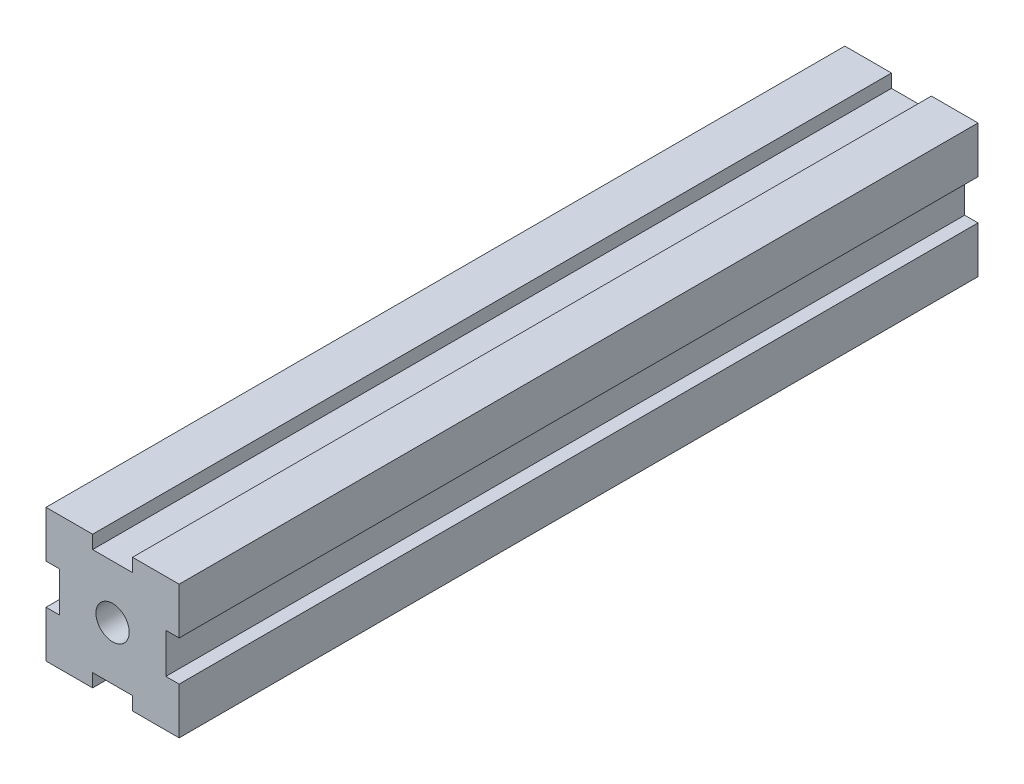
ISO-10303-21;
HEADER;
FILE_DESCRIPTION(('STEP AP214'),'2;1');
FILE_NAME('part.step','',(''),(''),'','','');
FILE_SCHEMA(('AUTOMOTIVE_DESIGN { 1 0 10303 214 1 1 1 1 }'));
ENDSEC;
DATA;
#1=APPLICATION_CONTEXT('core data for automotive mechanical design processes');
#2=APPLICATION_PROTOCOL_DEFINITION('international standard','automotive_design',2000,#1);
#3=PRODUCT_CONTEXT('',#1,'mechanical');
#4=PRODUCT('Part','Part','',(#3));
#5=PRODUCT_RELATED_PRODUCT_CATEGORY('part','',(#4));
#6=PRODUCT_DEFINITION_FORMATION('','',#4);
#7=PRODUCT_DEFINITION_CONTEXT('part definition',#1,'design');
#8=PRODUCT_DEFINITION('design','',#6,#7);
#9=PRODUCT_DEFINITION_SHAPE('','',#8);
#10=(LENGTH_UNIT() NAMED_UNIT(*) SI_UNIT(.MILLI.,.METRE.));
#11=(NAMED_UNIT(*) PLANE_ANGLE_UNIT() SI_UNIT($,.RADIAN.));
#12=(NAMED_UNIT(*) SI_UNIT($,.STERADIAN.) SOLID_ANGLE_UNIT());
#13=UNCERTAINTY_MEASURE_WITH_UNIT(LENGTH_MEASURE(1.E-05),#10,'distance_accuracy_value','');
#14=(GEOMETRIC_REPRESENTATION_CONTEXT(3) GLOBAL_UNCERTAINTY_ASSIGNED_CONTEXT((#13)) GLOBAL_UNIT_ASSIGNED_CONTEXT((#10,
#11,#12)) REPRESENTATION_CONTEXT('',''));
#15=CARTESIAN_POINT('',(0.,0.,0.));
#16=DIRECTION('',(0.,0.,1.));
#17=DIRECTION('',(1.,0.,0.));
#18=AXIS2_PLACEMENT_3D('',#15,#16,#17);
#19=CARTESIAN_POINT('',(0.,0.,120.));
#20=DIRECTION('',(0.,0.,1.));
#21=DIRECTION('',(1.,0.,0.));
#22=AXIS2_PLACEMENT_3D('',#19,#20,#21);
#23=PLANE('',#22);
#24=DIRECTION('',(0.,-1.,0.));
#25=VECTOR('',#24,1.);
#26=CARTESIAN_POINT('',(0.,0.,120.));
#27=LINE('',#26,#25);
#28=CARTESIAN_POINT('',(0.,0.,120.));
#29=VERTEX_POINT('',#28);
#30=CARTESIAN_POINT('',(0.,-7.,120.));
#31=VERTEX_POINT('',#30);
#32=EDGE_CURVE('E242',#29,#31,#27,.T.);
#33=ORIENTED_EDGE('',*,*,#32,.T.);
#34=DIRECTION('',(1.,0.,0.));
#35=VECTOR('',#34,1.);
#36=CARTESIAN_POINT('',(0.,-7.,120.));
#37=LINE('',#36,#35);
#38=CARTESIAN_POINT('',(2.,-7.,120.));
#39=VERTEX_POINT('',#38);
#40=EDGE_CURVE('E130',#31,#39,#37,.T.);
#41=ORIENTED_EDGE('',*,*,#40,.T.);
#42=DIRECTION('',(0.,-1.,0.));
#43=VECTOR('',#42,1.);
#44=CARTESIAN_POINT('',(2.,-7.,120.));
#45=LINE('',#44,#43);
#46=CARTESIAN_POINT('',(2.,-13.,120.));
#47=VERTEX_POINT('',#46);
#48=EDGE_CURVE('E293',#39,#47,#45,.T.);
#49=ORIENTED_EDGE('',*,*,#48,.T.);
#50=DIRECTION('',(-1.,0.,0.));
#51=VECTOR('',#50,1.);
#52=CARTESIAN_POINT('',(0.,-13.,120.));
#53=LINE('',#52,#51);
#54=CARTESIAN_POINT('',(0.,-13.,120.));
#55=VERTEX_POINT('',#54);
#56=EDGE_CURVE('E312',#47,#55,#53,.T.);
#57=ORIENTED_EDGE('',*,*,#56,.T.);
#58=DIRECTION('',(0.,-1.,0.));
#59=VECTOR('',#58,1.);
#60=CARTESIAN_POINT('',(0.,-13.,120.));
#61=LINE('',#60,#59);
#62=CARTESIAN_POINT('',(0.,-20.,120.));
#63=VERTEX_POINT('',#62);
#64=EDGE_CURVE('E309',#55,#63,#61,.T.);
#65=ORIENTED_EDGE('',*,*,#64,.T.);
#66=DIRECTION('',(1.,0.,0.));
#67=VECTOR('',#66,1.);
#68=CARTESIAN_POINT('',(0.,-20.,120.));
#69=LINE('',#68,#67);
#70=CARTESIAN_POINT('',(7.,-20.,120.));
#71=VERTEX_POINT('',#70);
#72=EDGE_CURVE('E311',#63,#71,#69,.T.);
#73=ORIENTED_EDGE('',*,*,#72,.T.);
#74=DIRECTION('',(0.,1.,0.));
#75=VECTOR('',#74,1.);
#76=CARTESIAN_POINT('',(7.,-20.,120.));
#77=LINE('',#76,#75);
#78=CARTESIAN_POINT('',(7.,-18.,120.));
#79=VERTEX_POINT('',#78);
#80=EDGE_CURVE('E314',#71,#79,#77,.T.);
#81=ORIENTED_EDGE('',*,*,#80,.T.);
#82=DIRECTION('',(1.,0.,0.));
#83=VECTOR('',#82,1.);
#84=CARTESIAN_POINT('',(7.,-18.,120.));
#85=LINE('',#84,#83);
#86=CARTESIAN_POINT('',(13.,-18.,120.));
#87=VERTEX_POINT('',#86);
#88=EDGE_CURVE('E320',#79,#87,#85,.T.);
#89=ORIENTED_EDGE('',*,*,#88,.T.);
#90=DIRECTION('',(0.,-1.,0.));
#91=VECTOR('',#90,1.);
#92=CARTESIAN_POINT('',(13.,-20.,120.));
#93=LINE('',#92,#91);
#94=CARTESIAN_POINT('',(13.,-20.,120.));
#95=VERTEX_POINT('',#94);
#96=EDGE_CURVE('E322',#87,#95,#93,.T.);
#97=ORIENTED_EDGE('',*,*,#96,.T.);
#98=DIRECTION('',(1.,0.,0.));
#99=VECTOR('',#98,1.);
#100=CARTESIAN_POINT('',(13.,-20.,120.));
#101=LINE('',#100,#99);
#102=CARTESIAN_POINT('',(20.,-20.,120.));
#103=VERTEX_POINT('',#102);
#104=EDGE_CURVE('E324',#95,#103,#101,.T.);
#105=ORIENTED_EDGE('',*,*,#104,.T.);
#106=DIRECTION('',(0.,1.,0.));
#107=VECTOR('',#106,1.);
#108=CARTESIAN_POINT('',(20.,-13.,120.));
#109=LINE('',#108,#107);
#110=CARTESIAN_POINT('',(20.,-13.,120.));
#111=VERTEX_POINT('',#110);
#112=EDGE_CURVE('E326',#103,#111,#109,.T.);
#113=ORIENTED_EDGE('',*,*,#112,.T.);
#114=DIRECTION('',(-1.,0.,0.));
#115=VECTOR('',#114,1.);
#116=CARTESIAN_POINT('',(20.,-13.,120.));
#117=LINE('',#116,#115);
#118=CARTESIAN_POINT('',(18.,-13.,120.));
#119=VERTEX_POINT('',#118);
#120=EDGE_CURVE('E328',#111,#119,#117,.T.);
#121=ORIENTED_EDGE('',*,*,#120,.T.);
#122=DIRECTION('',(0.,1.,0.));
#123=VECTOR('',#122,1.);
#124=CARTESIAN_POINT('',(18.,-7.,120.));
#125=LINE('',#124,#123);
#126=CARTESIAN_POINT('',(18.,-7.,120.));
#127=VERTEX_POINT('',#126);
#128=EDGE_CURVE('E330',#119,#127,#125,.T.);
#129=ORIENTED_EDGE('',*,*,#128,.T.);
#130=DIRECTION('',(1.,0.,0.));
#131=VECTOR('',#130,1.);
#132=CARTESIAN_POINT('',(20.,-7.,120.));
#133=LINE('',#132,#131);
#134=CARTESIAN_POINT('',(20.,-7.,120.));
#135=VERTEX_POINT('',#134);
#136=EDGE_CURVE('E332',#127,#135,#133,.T.);
#137=ORIENTED_EDGE('',*,*,#136,.T.);
#138=DIRECTION('',(0.,1.,0.));
#139=VECTOR('',#138,1.);
#140=CARTESIAN_POINT('',(20.,0.,120.));
#141=LINE('',#140,#139);
#142=CARTESIAN_POINT('',(20.,0.,120.));
#143=VERTEX_POINT('',#142);
#144=EDGE_CURVE('E334',#135,#143,#141,.T.);
#145=ORIENTED_EDGE('',*,*,#144,.T.);
#146=DIRECTION('',(-1.,0.,0.));
#147=VECTOR('',#146,1.);
#148=CARTESIAN_POINT('',(13.,0.,120.));
#149=LINE('',#148,#147);
#150=CARTESIAN_POINT('',(13.,0.,120.));
#151=VERTEX_POINT('',#150);
#152=EDGE_CURVE('E336',#143,#151,#149,.T.);
#153=ORIENTED_EDGE('',*,*,#152,.T.);
#154=DIRECTION('',(0.,-1.,0.));
#155=VECTOR('',#154,1.);
#156=CARTESIAN_POINT('',(13.,0.,120.));
#157=LINE('',#156,#155);
#158=CARTESIAN_POINT('',(13.,-2.,120.));
#159=VERTEX_POINT('',#158);
#160=EDGE_CURVE('E185',#151,#159,#157,.T.);
#161=ORIENTED_EDGE('',*,*,#160,.T.);
#162=DIRECTION('',(-1.,0.,0.));
#163=VECTOR('',#162,1.);
#164=CARTESIAN_POINT('',(7.,-2.,120.));
#165=LINE('',#164,#163);
#166=CARTESIAN_POINT('',(7.,-2.,120.));
#167=VERTEX_POINT('',#166);
#168=EDGE_CURVE('E179',#159,#167,#165,.T.);
#169=ORIENTED_EDGE('',*,*,#168,.T.);
#170=DIRECTION('',(0.,1.,0.));
#171=VECTOR('',#170,1.);
#172=CARTESIAN_POINT('',(7.,0.,120.));
#173=LINE('',#172,#171);
#174=CARTESIAN_POINT('',(7.,0.,120.));
#175=VERTEX_POINT('',#174);
#176=EDGE_CURVE('E183',#167,#175,#173,.T.);
#177=ORIENTED_EDGE('',*,*,#176,.T.);
#178=DIRECTION('',(-1.,0.,0.));
#179=VECTOR('',#178,1.);
#180=CARTESIAN_POINT('',(0.,0.,120.));
#181=LINE('',#180,#179);
#182=EDGE_CURVE('E51',#175,#29,#181,.T.);
#183=ORIENTED_EDGE('',*,*,#182,.T.);
#184=EDGE_LOOP('',(#33,#41,#49,#57,#65,#73,#81,#89,#97,#105,#113,#121,#129,#137,#145,#153,#161,
#169,#177,#183));
#185=FACE_BOUND('',#184,.T.);
#186=CARTESIAN_POINT('',(10.,-10.,120.));
#187=DIRECTION('',(0.,0.,1.));
#188=DIRECTION('',(1.,0.,0.));
#189=AXIS2_PLACEMENT_3D('',#186,#187,#188);
#190=CIRCLE('',#189,2.5);
#191=CARTESIAN_POINT('',(12.5,-10.,120.));
#192=VERTEX_POINT('',#191);
#193=EDGE_CURVE('E207',#192,#192,#190,.T.);
#194=ORIENTED_EDGE('',*,*,#193,.F.);
#195=EDGE_LOOP('',(#194));
#196=FACE_BOUND('',#195,.T.);
#197=ADVANCED_FACE('F34',(#185,#196),#23,.T.);
#198=CARTESIAN_POINT('',(0.,0.,0.));
#199=DIRECTION('',(0.,0.,1.));
#200=DIRECTION('',(1.,0.,0.));
#201=AXIS2_PLACEMENT_3D('',#198,#199,#200);
#202=PLANE('',#201);
#203=DIRECTION('',(0.,-1.,0.));
#204=VECTOR('',#203,1.);
#205=CARTESIAN_POINT('',(0.,0.,0.));
#206=LINE('',#205,#204);
#207=CARTESIAN_POINT('',(0.,0.,0.));
#208=VERTEX_POINT('',#207);
#209=CARTESIAN_POINT('',(0.,-7.,0.));
#210=VERTEX_POINT('',#209);
#211=EDGE_CURVE('E203',#208,#210,#206,.T.);
#212=ORIENTED_EDGE('',*,*,#211,.F.);
#213=DIRECTION('',(-1.,0.,0.));
#214=VECTOR('',#213,1.);
#215=CARTESIAN_POINT('',(0.,0.,0.));
#216=LINE('',#215,#214);
#217=CARTESIAN_POINT('',(7.,0.,0.));
#218=VERTEX_POINT('',#217);
#219=EDGE_CURVE('E122',#218,#208,#216,.T.);
#220=ORIENTED_EDGE('',*,*,#219,.F.);
#221=DIRECTION('',(0.,1.,0.));
#222=VECTOR('',#221,1.);
#223=CARTESIAN_POINT('',(7.,0.,0.));
#224=LINE('',#223,#222);
#225=CARTESIAN_POINT('',(7.,-2.,0.));
#226=VERTEX_POINT('',#225);
#227=EDGE_CURVE('E116',#226,#218,#224,.T.);
#228=ORIENTED_EDGE('',*,*,#227,.F.);
#229=DIRECTION('',(-1.,0.,0.));
#230=VECTOR('',#229,1.);
#231=CARTESIAN_POINT('',(7.,-2.,0.));
#232=LINE('',#231,#230);
#233=CARTESIAN_POINT('',(13.,-2.,0.));
#234=VERTEX_POINT('',#233);
#235=EDGE_CURVE('E193',#234,#226,#232,.T.);
#236=ORIENTED_EDGE('',*,*,#235,.F.);
#237=DIRECTION('',(0.,-1.,0.));
#238=VECTOR('',#237,1.);
#239=CARTESIAN_POINT('',(13.,0.,0.));
#240=LINE('',#239,#238);
#241=CARTESIAN_POINT('',(13.,0.,0.));
#242=VERTEX_POINT('',#241);
#243=EDGE_CURVE('E237',#242,#234,#240,.T.);
#244=ORIENTED_EDGE('',*,*,#243,.F.);
#245=DIRECTION('',(-1.,0.,0.));
#246=VECTOR('',#245,1.);
#247=CARTESIAN_POINT('',(13.,0.,0.));
#248=LINE('',#247,#246);
#249=CARTESIAN_POINT('',(20.,0.,0.));
#250=VERTEX_POINT('',#249);
#251=EDGE_CURVE('E235',#250,#242,#248,.T.);
#252=ORIENTED_EDGE('',*,*,#251,.F.);
#253=DIRECTION('',(0.,1.,0.));
#254=VECTOR('',#253,1.);
#255=CARTESIAN_POINT('',(20.,0.,0.));
#256=LINE('',#255,#254);
#257=CARTESIAN_POINT('',(20.,-7.,0.));
#258=VERTEX_POINT('',#257);
#259=EDGE_CURVE('E233',#258,#250,#256,.T.);
#260=ORIENTED_EDGE('',*,*,#259,.F.);
#261=DIRECTION('',(1.,0.,0.));
#262=VECTOR('',#261,1.);
#263=CARTESIAN_POINT('',(20.,-7.,0.));
#264=LINE('',#263,#262);
#265=CARTESIAN_POINT('',(18.,-7.,0.));
#266=VERTEX_POINT('',#265);
#267=EDGE_CURVE('E231',#266,#258,#264,.T.);
#268=ORIENTED_EDGE('',*,*,#267,.F.);
#269=DIRECTION('',(0.,1.,0.));
#270=VECTOR('',#269,1.);
#271=CARTESIAN_POINT('',(18.,-7.,0.));
#272=LINE('',#271,#270);
#273=CARTESIAN_POINT('',(18.,-13.,0.));
#274=VERTEX_POINT('',#273);
#275=EDGE_CURVE('E229',#274,#266,#272,.T.);
#276=ORIENTED_EDGE('',*,*,#275,.F.);
#277=DIRECTION('',(-1.,0.,0.));
#278=VECTOR('',#277,1.);
#279=CARTESIAN_POINT('',(20.,-13.,0.));
#280=LINE('',#279,#278);
#281=CARTESIAN_POINT('',(20.,-13.,0.));
#282=VERTEX_POINT('',#281);
#283=EDGE_CURVE('E227',#282,#274,#280,.T.);
#284=ORIENTED_EDGE('',*,*,#283,.F.);
#285=DIRECTION('',(0.,1.,0.));
#286=VECTOR('',#285,1.);
#287=CARTESIAN_POINT('',(20.,-13.,0.));
#288=LINE('',#287,#286);
#289=CARTESIAN_POINT('',(20.,-20.,0.));
#290=VERTEX_POINT('',#289);
#291=EDGE_CURVE('E225',#290,#282,#288,.T.);
#292=ORIENTED_EDGE('',*,*,#291,.F.);
#293=DIRECTION('',(1.,0.,0.));
#294=VECTOR('',#293,1.);
#295=CARTESIAN_POINT('',(13.,-20.,0.));
#296=LINE('',#295,#294);
#297=CARTESIAN_POINT('',(13.,-20.,0.));
#298=VERTEX_POINT('',#297);
#299=EDGE_CURVE('E223',#298,#290,#296,.T.);
#300=ORIENTED_EDGE('',*,*,#299,.F.);
#301=DIRECTION('',(0.,-1.,0.));
#302=VECTOR('',#301,1.);
#303=CARTESIAN_POINT('',(13.,-20.,0.));
#304=LINE('',#303,#302);
#305=CARTESIAN_POINT('',(13.,-18.,0.));
#306=VERTEX_POINT('',#305);
#307=EDGE_CURVE('E221',#306,#298,#304,.T.);
#308=ORIENTED_EDGE('',*,*,#307,.F.);
#309=DIRECTION('',(1.,0.,0.));
#310=VECTOR('',#309,1.);
#311=CARTESIAN_POINT('',(7.,-18.,0.));
#312=LINE('',#311,#310);
#313=CARTESIAN_POINT('',(7.,-18.,0.));
#314=VERTEX_POINT('',#313);
#315=EDGE_CURVE('E219',#314,#306,#312,.T.);
#316=ORIENTED_EDGE('',*,*,#315,.F.);
#317=DIRECTION('',(0.,1.,0.));
#318=VECTOR('',#317,1.);
#319=CARTESIAN_POINT('',(7.,-20.,0.));
#320=LINE('',#319,#318);
#321=CARTESIAN_POINT('',(7.,-20.,0.));
#322=VERTEX_POINT('',#321);
#323=EDGE_CURVE('E217',#322,#314,#320,.T.);
#324=ORIENTED_EDGE('',*,*,#323,.F.);
#325=DIRECTION('',(1.,0.,0.));
#326=VECTOR('',#325,1.);
#327=CARTESIAN_POINT('',(0.,-20.,0.));
#328=LINE('',#327,#326);
#329=CARTESIAN_POINT('',(0.,-20.,0.));
#330=VERTEX_POINT('',#329);
#331=EDGE_CURVE('E215',#330,#322,#328,.T.);
#332=ORIENTED_EDGE('',*,*,#331,.F.);
#333=DIRECTION('',(0.,-1.,0.));
#334=VECTOR('',#333,1.);
#335=CARTESIAN_POINT('',(0.,-13.,0.));
#336=LINE('',#335,#334);
#337=CARTESIAN_POINT('',(0.,-13.,0.));
#338=VERTEX_POINT('',#337);
#339=EDGE_CURVE('E213',#338,#330,#336,.T.);
#340=ORIENTED_EDGE('',*,*,#339,.F.);
#341=DIRECTION('',(-1.,0.,0.));
#342=VECTOR('',#341,1.);
#343=CARTESIAN_POINT('',(0.,-13.,0.));
#344=LINE('',#343,#342);
#345=CARTESIAN_POINT('',(2.,-13.,0.));
#346=VERTEX_POINT('',#345);
#347=EDGE_CURVE('E211',#346,#338,#344,.T.);
#348=ORIENTED_EDGE('',*,*,#347,.F.);
#349=DIRECTION('',(0.,-1.,0.));
#350=VECTOR('',#349,1.);
#351=CARTESIAN_POINT('',(2.,-7.,0.));
#352=LINE('',#351,#350);
#353=CARTESIAN_POINT('',(2.,-7.,0.));
#354=VERTEX_POINT('',#353);
#355=EDGE_CURVE('E209',#354,#346,#352,.T.);
#356=ORIENTED_EDGE('',*,*,#355,.F.);
#357=DIRECTION('',(1.,0.,0.));
#358=VECTOR('',#357,1.);
#359=CARTESIAN_POINT('',(0.,-7.,0.));
#360=LINE('',#359,#358);
#361=EDGE_CURVE('E206',#210,#354,#360,.T.);
#362=ORIENTED_EDGE('',*,*,#361,.F.);
#363=EDGE_LOOP('',(#212,#220,#228,#236,#244,#252,#260,#268,#276,#284,#292,#300,#308,#316,#324,
#332,#340,#348,#356,#362));
#364=FACE_BOUND('',#363,.T.);
#365=CARTESIAN_POINT('',(10.,-10.,0.));
#366=DIRECTION('',(0.,0.,1.));
#367=DIRECTION('',(1.,0.,0.));
#368=AXIS2_PLACEMENT_3D('',#365,#366,#367);
#369=CIRCLE('',#368,2.5);
#370=CARTESIAN_POINT('',(12.5,-10.,0.));
#371=VERTEX_POINT('',#370);
#372=EDGE_CURVE('E587',#371,#371,#369,.T.);
#373=ORIENTED_EDGE('',*,*,#372,.T.);
#374=EDGE_LOOP('',(#373));
#375=FACE_BOUND('',#374,.T.);
#376=ADVANCED_FACE('F297',(#364,#375),#202,.F.);
#377=CARTESIAN_POINT('',(0.,0.,120.));
#378=DIRECTION('',(1.,0.,0.));
#379=DIRECTION('',(0.,1.,0.));
#380=AXIS2_PLACEMENT_3D('',#377,#378,#379);
#381=PLANE('',#380);
#382=ORIENTED_EDGE('',*,*,#211,.T.);
#383=DIRECTION('',(0.,0.,-1.));
#384=VECTOR('',#383,1.);
#385=CARTESIAN_POINT('',(0.,-7.,120.));
#386=LINE('',#385,#384);
#387=EDGE_CURVE('E11',#31,#210,#386,.T.);
#388=ORIENTED_EDGE('',*,*,#387,.F.);
#389=ORIENTED_EDGE('',*,*,#32,.F.);
#390=DIRECTION('',(0.,0.,-1.));
#391=VECTOR('',#390,1.);
#392=CARTESIAN_POINT('',(0.,0.,120.));
#393=LINE('',#392,#391);
#394=EDGE_CURVE('E199',#29,#208,#393,.T.);
#395=ORIENTED_EDGE('',*,*,#394,.T.);
#396=EDGE_LOOP('',(#382,#388,#389,#395));
#397=FACE_BOUND('',#396,.T.);
#398=ADVANCED_FACE('F36',(#397),#381,.F.);
#399=CARTESIAN_POINT('',(0.,-7.,120.));
#400=DIRECTION('',(0.,1.,0.));
#401=DIRECTION('',(-1.,0.,0.));
#402=AXIS2_PLACEMENT_3D('',#399,#400,#401);
#403=PLANE('',#402);
#404=ORIENTED_EDGE('',*,*,#361,.T.);
#405=DIRECTION('',(0.,0.,-1.));
#406=VECTOR('',#405,1.);
#407=CARTESIAN_POINT('',(2.,-7.,120.));
#408=LINE('',#407,#406);
#409=EDGE_CURVE('E43',#39,#354,#408,.T.);
#410=ORIENTED_EDGE('',*,*,#409,.F.);
#411=ORIENTED_EDGE('',*,*,#40,.F.);
#412=ORIENTED_EDGE('',*,*,#387,.T.);
#413=EDGE_LOOP('',(#404,#410,#411,#412));
#414=FACE_BOUND('',#413,.T.);
#415=ADVANCED_FACE('F370',(#414),#403,.F.);
#416=CARTESIAN_POINT('',(2.,-7.,120.));
#417=DIRECTION('',(1.,0.,0.));
#418=DIRECTION('',(0.,0.,-1.));
#419=AXIS2_PLACEMENT_3D('',#416,#417,#418);
#420=PLANE('',#419);
#421=ORIENTED_EDGE('',*,*,#355,.T.);
#422=DIRECTION('',(0.,0.,-1.));
#423=VECTOR('',#422,1.);
#424=CARTESIAN_POINT('',(2.,-13.,120.));
#425=LINE('',#424,#423);
#426=EDGE_CURVE('E285',#47,#346,#425,.T.);
#427=ORIENTED_EDGE('',*,*,#426,.F.);
#428=ORIENTED_EDGE('',*,*,#48,.F.);
#429=ORIENTED_EDGE('',*,*,#409,.T.);
#430=EDGE_LOOP('',(#421,#427,#428,#429));
#431=FACE_BOUND('',#430,.T.);
#432=ADVANCED_FACE('F291',(#431),#420,.F.);
#433=CARTESIAN_POINT('',(0.,-13.,120.));
#434=DIRECTION('',(0.,-1.,0.));
#435=DIRECTION('',(1.,0.,0.));
#436=AXIS2_PLACEMENT_3D('',#433,#434,#435);
#437=PLANE('',#436);
#438=ORIENTED_EDGE('',*,*,#347,.T.);
#439=DIRECTION('',(0.,0.,-1.));
#440=VECTOR('',#439,1.);
#441=CARTESIAN_POINT('',(0.,-13.,120.));
#442=LINE('',#441,#440);
#443=EDGE_CURVE('E282',#55,#338,#442,.T.);
#444=ORIENTED_EDGE('',*,*,#443,.F.);
#445=ORIENTED_EDGE('',*,*,#56,.F.);
#446=ORIENTED_EDGE('',*,*,#426,.T.);
#447=EDGE_LOOP('',(#438,#444,#445,#446));
#448=FACE_BOUND('',#447,.T.);
#449=ADVANCED_FACE('F303',(#448),#437,.F.);
#450=CARTESIAN_POINT('',(0.,-13.,120.));
#451=DIRECTION('',(1.,0.,0.));
#452=DIRECTION('',(0.,1.,0.));
#453=AXIS2_PLACEMENT_3D('',#450,#451,#452);
#454=PLANE('',#453);
#455=ORIENTED_EDGE('',*,*,#339,.T.);
#456=DIRECTION('',(0.,0.,-1.));
#457=VECTOR('',#456,1.);
#458=CARTESIAN_POINT('',(0.,-20.,120.));
#459=LINE('',#458,#457);
#460=EDGE_CURVE('E279',#63,#330,#459,.T.);
#461=ORIENTED_EDGE('',*,*,#460,.F.);
#462=ORIENTED_EDGE('',*,*,#64,.F.);
#463=ORIENTED_EDGE('',*,*,#443,.T.);
#464=EDGE_LOOP('',(#455,#461,#462,#463));
#465=FACE_BOUND('',#464,.T.);
#466=ADVANCED_FACE('F307',(#465),#454,.F.);
#467=CARTESIAN_POINT('',(0.,-20.,120.));
#468=DIRECTION('',(0.,1.,0.));
#469=DIRECTION('',(0.,0.,1.));
#470=AXIS2_PLACEMENT_3D('',#467,#468,#469);
#471=PLANE('',#470);
#472=ORIENTED_EDGE('',*,*,#331,.T.);
#473=DIRECTION('',(0.,0.,-1.));
#474=VECTOR('',#473,1.);
#475=CARTESIAN_POINT('',(7.,-20.,120.));
#476=LINE('',#475,#474);
#477=EDGE_CURVE('E276',#71,#322,#476,.T.);
#478=ORIENTED_EDGE('',*,*,#477,.F.);
#479=ORIENTED_EDGE('',*,*,#72,.F.);
#480=ORIENTED_EDGE('',*,*,#460,.T.);
#481=EDGE_LOOP('',(#472,#478,#479,#480));
#482=FACE_BOUND('',#481,.T.);
#483=ADVANCED_FACE('F383',(#482),#471,.F.);
#484=CARTESIAN_POINT('',(7.,-20.,120.));
#485=DIRECTION('',(-1.,0.,0.));
#486=DIRECTION('',(0.,-1.,0.));
#487=AXIS2_PLACEMENT_3D('',#484,#485,#486);
#488=PLANE('',#487);
#489=ORIENTED_EDGE('',*,*,#323,.T.);
#490=DIRECTION('',(0.,0.,-1.));
#491=VECTOR('',#490,1.);
#492=CARTESIAN_POINT('',(7.,-18.,120.));
#493=LINE('',#492,#491);
#494=EDGE_CURVE('E273',#79,#314,#493,.T.);
#495=ORIENTED_EDGE('',*,*,#494,.F.);
#496=ORIENTED_EDGE('',*,*,#80,.F.);
#497=ORIENTED_EDGE('',*,*,#477,.T.);
#498=EDGE_LOOP('',(#489,#495,#496,#497));
#499=FACE_BOUND('',#498,.T.);
#500=ADVANCED_FACE('F386',(#499),#488,.F.);
#501=CARTESIAN_POINT('',(7.,-18.,120.));
#502=DIRECTION('',(0.,1.,0.));
#503=DIRECTION('',(0.,0.,1.));
#504=AXIS2_PLACEMENT_3D('',#501,#502,#503);
#505=PLANE('',#504);
#506=ORIENTED_EDGE('',*,*,#315,.T.);
#507=DIRECTION('',(0.,0.,-1.));
#508=VECTOR('',#507,1.);
#509=CARTESIAN_POINT('',(13.,-18.,120.));
#510=LINE('',#509,#508);
#511=EDGE_CURVE('E270',#87,#306,#510,.T.);
#512=ORIENTED_EDGE('',*,*,#511,.F.);
#513=ORIENTED_EDGE('',*,*,#88,.F.);
#514=ORIENTED_EDGE('',*,*,#494,.T.);
#515=EDGE_LOOP('',(#506,#512,#513,#514));
#516=FACE_BOUND('',#515,.T.);
#517=ADVANCED_FACE('F390',(#516),#505,.F.);
#518=CARTESIAN_POINT('',(13.,-20.,120.));
#519=DIRECTION('',(1.,0.,0.));
#520=DIRECTION('',(0.,1.,0.));
#521=AXIS2_PLACEMENT_3D('',#518,#519,#520);
#522=PLANE('',#521);
#523=ORIENTED_EDGE('',*,*,#307,.T.);
#524=DIRECTION('',(0.,0.,-1.));
#525=VECTOR('',#524,1.);
#526=CARTESIAN_POINT('',(13.,-20.,120.));
#527=LINE('',#526,#525);
#528=EDGE_CURVE('E267',#95,#298,#527,.T.);
#529=ORIENTED_EDGE('',*,*,#528,.F.);
#530=ORIENTED_EDGE('',*,*,#96,.F.);
#531=ORIENTED_EDGE('',*,*,#511,.T.);
#532=EDGE_LOOP('',(#523,#529,#530,#531));
#533=FACE_BOUND('',#532,.T.);
#534=ADVANCED_FACE('F394',(#533),#522,.F.);
#535=CARTESIAN_POINT('',(13.,-20.,120.));
#536=DIRECTION('',(0.,1.,0.));
#537=DIRECTION('',(0.,0.,1.));
#538=AXIS2_PLACEMENT_3D('',#535,#536,#537);
#539=PLANE('',#538);
#540=ORIENTED_EDGE('',*,*,#299,.T.);
#541=DIRECTION('',(0.,0.,-1.));
#542=VECTOR('',#541,1.);
#543=CARTESIAN_POINT('',(20.,-20.,120.));
#544=LINE('',#543,#542);
#545=EDGE_CURVE('E264',#103,#290,#544,.T.);
#546=ORIENTED_EDGE('',*,*,#545,.F.);
#547=ORIENTED_EDGE('',*,*,#104,.F.);
#548=ORIENTED_EDGE('',*,*,#528,.T.);
#549=EDGE_LOOP('',(#540,#546,#547,#548));
#550=FACE_BOUND('',#549,.T.);
#551=ADVANCED_FACE('F398',(#550),#539,.F.);
#552=CARTESIAN_POINT('',(20.,-13.,120.));
#553=DIRECTION('',(-1.,0.,0.));
#554=DIRECTION('',(0.,0.,1.));
#555=AXIS2_PLACEMENT_3D('',#552,#553,#554);
#556=PLANE('',#555);
#557=ORIENTED_EDGE('',*,*,#291,.T.);
#558=DIRECTION('',(0.,0.,-1.));
#559=VECTOR('',#558,1.);
#560=CARTESIAN_POINT('',(20.,-13.,120.));
#561=LINE('',#560,#559);
#562=EDGE_CURVE('E261',#111,#282,#561,.T.);
#563=ORIENTED_EDGE('',*,*,#562,.F.);
#564=ORIENTED_EDGE('',*,*,#112,.F.);
#565=ORIENTED_EDGE('',*,*,#545,.T.);
#566=EDGE_LOOP('',(#557,#563,#564,#565));
#567=FACE_BOUND('',#566,.T.);
#568=ADVANCED_FACE('F402',(#567),#556,.F.);
#569=CARTESIAN_POINT('',(20.,-13.,120.));
#570=DIRECTION('',(0.,-1.,0.));
#571=DIRECTION('',(1.,0.,0.));
#572=AXIS2_PLACEMENT_3D('',#569,#570,#571);
#573=PLANE('',#572);
#574=ORIENTED_EDGE('',*,*,#283,.T.);
#575=DIRECTION('',(0.,0.,-1.));
#576=VECTOR('',#575,1.);
#577=CARTESIAN_POINT('',(18.,-13.,120.));
#578=LINE('',#577,#576);
#579=EDGE_CURVE('E258',#119,#274,#578,.T.);
#580=ORIENTED_EDGE('',*,*,#579,.F.);
#581=ORIENTED_EDGE('',*,*,#120,.F.);
#582=ORIENTED_EDGE('',*,*,#562,.T.);
#583=EDGE_LOOP('',(#574,#580,#581,#582));
#584=FACE_BOUND('',#583,.T.);
#585=ADVANCED_FACE('F406',(#584),#573,.F.);
#586=CARTESIAN_POINT('',(18.,-7.,120.));
#587=DIRECTION('',(-1.,0.,0.));
#588=DIRECTION('',(0.,0.,1.));
#589=AXIS2_PLACEMENT_3D('',#586,#587,#588);
#590=PLANE('',#589);
#591=ORIENTED_EDGE('',*,*,#275,.T.);
#592=DIRECTION('',(0.,0.,-1.));
#593=VECTOR('',#592,1.);
#594=CARTESIAN_POINT('',(18.,-7.,120.));
#595=LINE('',#594,#593);
#596=EDGE_CURVE('E255',#127,#266,#595,.T.);
#597=ORIENTED_EDGE('',*,*,#596,.F.);
#598=ORIENTED_EDGE('',*,*,#128,.F.);
#599=ORIENTED_EDGE('',*,*,#579,.T.);
#600=EDGE_LOOP('',(#591,#597,#598,#599));
#601=FACE_BOUND('',#600,.T.);
#602=ADVANCED_FACE('F410',(#601),#590,.F.);
#603=CARTESIAN_POINT('',(20.,-7.,120.));
#604=DIRECTION('',(0.,1.,0.));
#605=DIRECTION('',(-1.,0.,0.));
#606=AXIS2_PLACEMENT_3D('',#603,#604,#605);
#607=PLANE('',#606);
#608=ORIENTED_EDGE('',*,*,#267,.T.);
#609=DIRECTION('',(0.,0.,-1.));
#610=VECTOR('',#609,1.);
#611=CARTESIAN_POINT('',(20.,-7.,120.));
#612=LINE('',#611,#610);
#613=EDGE_CURVE('E252',#135,#258,#612,.T.);
#614=ORIENTED_EDGE('',*,*,#613,.F.);
#615=ORIENTED_EDGE('',*,*,#136,.F.);
#616=ORIENTED_EDGE('',*,*,#596,.T.);
#617=EDGE_LOOP('',(#608,#614,#615,#616));
#618=FACE_BOUND('',#617,.T.);
#619=ADVANCED_FACE('F414',(#618),#607,.F.);
#620=CARTESIAN_POINT('',(20.,0.,120.));
#621=DIRECTION('',(-1.,0.,0.));
#622=DIRECTION('',(0.,-1.,0.));
#623=AXIS2_PLACEMENT_3D('',#620,#621,#622);
#624=PLANE('',#623);
#625=ORIENTED_EDGE('',*,*,#259,.T.);
#626=DIRECTION('',(0.,0.,-1.));
#627=VECTOR('',#626,1.);
#628=CARTESIAN_POINT('',(20.,0.,120.));
#629=LINE('',#628,#627);
#630=EDGE_CURVE('E249',#143,#250,#629,.T.);
#631=ORIENTED_EDGE('',*,*,#630,.F.);
#632=ORIENTED_EDGE('',*,*,#144,.F.);
#633=ORIENTED_EDGE('',*,*,#613,.T.);
#634=EDGE_LOOP('',(#625,#631,#632,#633));
#635=FACE_BOUND('',#634,.T.);
#636=ADVANCED_FACE('F418',(#635),#624,.F.);
#637=CARTESIAN_POINT('',(13.,0.,120.));
#638=DIRECTION('',(0.,-1.,0.));
#639=DIRECTION('',(0.,0.,-1.));
#640=AXIS2_PLACEMENT_3D('',#637,#638,#639);
#641=PLANE('',#640);
#642=ORIENTED_EDGE('',*,*,#251,.T.);
#643=DIRECTION('',(0.,0.,-1.));
#644=VECTOR('',#643,1.);
#645=CARTESIAN_POINT('',(13.,0.,120.));
#646=LINE('',#645,#644);
#647=EDGE_CURVE('E246',#151,#242,#646,.T.);
#648=ORIENTED_EDGE('',*,*,#647,.F.);
#649=ORIENTED_EDGE('',*,*,#152,.F.);
#650=ORIENTED_EDGE('',*,*,#630,.T.);
#651=EDGE_LOOP('',(#642,#648,#649,#650));
#652=FACE_BOUND('',#651,.T.);
#653=ADVANCED_FACE('F342',(#652),#641,.F.);
#654=CARTESIAN_POINT('',(13.,0.,120.));
#655=DIRECTION('',(1.,0.,0.));
#656=DIRECTION('',(0.,1.,0.));
#657=AXIS2_PLACEMENT_3D('',#654,#655,#656);
#658=PLANE('',#657);
#659=ORIENTED_EDGE('',*,*,#243,.T.);
#660=DIRECTION('',(0.,0.,-1.));
#661=VECTOR('',#660,1.);
#662=CARTESIAN_POINT('',(13.,-2.,120.));
#663=LINE('',#662,#661);
#664=EDGE_CURVE('E194',#159,#234,#663,.T.);
#665=ORIENTED_EDGE('',*,*,#664,.F.);
#666=ORIENTED_EDGE('',*,*,#160,.F.);
#667=ORIENTED_EDGE('',*,*,#647,.T.);
#668=EDGE_LOOP('',(#659,#665,#666,#667));
#669=FACE_BOUND('',#668,.T.);
#670=ADVANCED_FACE('F346',(#669),#658,.F.);
#671=CARTESIAN_POINT('',(7.,-2.,120.));
#672=DIRECTION('',(0.,-1.,0.));
#673=DIRECTION('',(0.,0.,-1.));
#674=AXIS2_PLACEMENT_3D('',#671,#672,#673);
#675=PLANE('',#674);
#676=ORIENTED_EDGE('',*,*,#235,.T.);
#677=DIRECTION('',(0.,0.,-1.));
#678=VECTOR('',#677,1.);
#679=CARTESIAN_POINT('',(7.,-2.,120.));
#680=LINE('',#679,#678);
#681=EDGE_CURVE('E190',#167,#226,#680,.T.);
#682=ORIENTED_EDGE('',*,*,#681,.F.);
#683=ORIENTED_EDGE('',*,*,#168,.F.);
#684=ORIENTED_EDGE('',*,*,#664,.T.);
#685=EDGE_LOOP('',(#676,#682,#683,#684));
#686=FACE_BOUND('',#685,.T.);
#687=ADVANCED_FACE('F191',(#686),#675,.F.);
#688=CARTESIAN_POINT('',(7.,0.,120.));
#689=DIRECTION('',(-1.,0.,0.));
#690=DIRECTION('',(0.,-1.,0.));
#691=AXIS2_PLACEMENT_3D('',#688,#689,#690);
#692=PLANE('',#691);
#693=ORIENTED_EDGE('',*,*,#227,.T.);
#694=DIRECTION('',(0.,0.,-1.));
#695=VECTOR('',#694,1.);
#696=CARTESIAN_POINT('',(7.,0.,120.));
#697=LINE('',#696,#695);
#698=EDGE_CURVE('E195',#175,#218,#697,.T.);
#699=ORIENTED_EDGE('',*,*,#698,.F.);
#700=ORIENTED_EDGE('',*,*,#176,.F.);
#701=ORIENTED_EDGE('',*,*,#681,.T.);
#702=EDGE_LOOP('',(#693,#699,#700,#701));
#703=FACE_BOUND('',#702,.T.);
#704=ADVANCED_FACE('F197',(#703),#692,.F.);
#705=CARTESIAN_POINT('',(0.,0.,120.));
#706=DIRECTION('',(0.,-1.,0.));
#707=DIRECTION('',(0.,0.,-1.));
#708=AXIS2_PLACEMENT_3D('',#705,#706,#707);
#709=PLANE('',#708);
#710=ORIENTED_EDGE('',*,*,#219,.T.);
#711=ORIENTED_EDGE('',*,*,#394,.F.);
#712=ORIENTED_EDGE('',*,*,#182,.F.);
#713=ORIENTED_EDGE('',*,*,#698,.T.);
#714=EDGE_LOOP('',(#710,#711,#712,#713));
#715=FACE_BOUND('',#714,.T.);
#716=ADVANCED_FACE('F350',(#715),#709,.F.);
#717=CARTESIAN_POINT('',(10.,-10.,120.));
#718=DIRECTION('',(0.,0.,-1.));
#719=DIRECTION('',(-1.,0.,0.));
#720=AXIS2_PLACEMENT_3D('',#717,#718,#719);
#721=CYLINDRICAL_SURFACE('',#720,2.5);
#722=ORIENTED_EDGE('',*,*,#193,.T.);
#723=EDGE_LOOP('',(#722));
#724=FACE_BOUND('',#723,.T.);
#725=ORIENTED_EDGE('',*,*,#372,.F.);
#726=EDGE_LOOP('',(#725));
#727=FACE_BOUND('',#726,.T.);
#728=ADVANCED_FACE('F352',(#724,#727),#721,.F.);
#729=CLOSED_SHELL('',(#197,#376,#398,#415,#432,#449,#466,#483,#500,#517,#534,#551,#568,#585,
#602,#619,#636,#653,#670,#687,#704,#716,#728));
#730=MANIFOLD_SOLID_BREP('B2',#729);
#731=ADVANCED_BREP_SHAPE_REPRESENTATION('',(#18,#730),#14);
#732=SHAPE_DEFINITION_REPRESENTATION(#9,#731);
ENDSEC;
END-ISO-10303-21;
